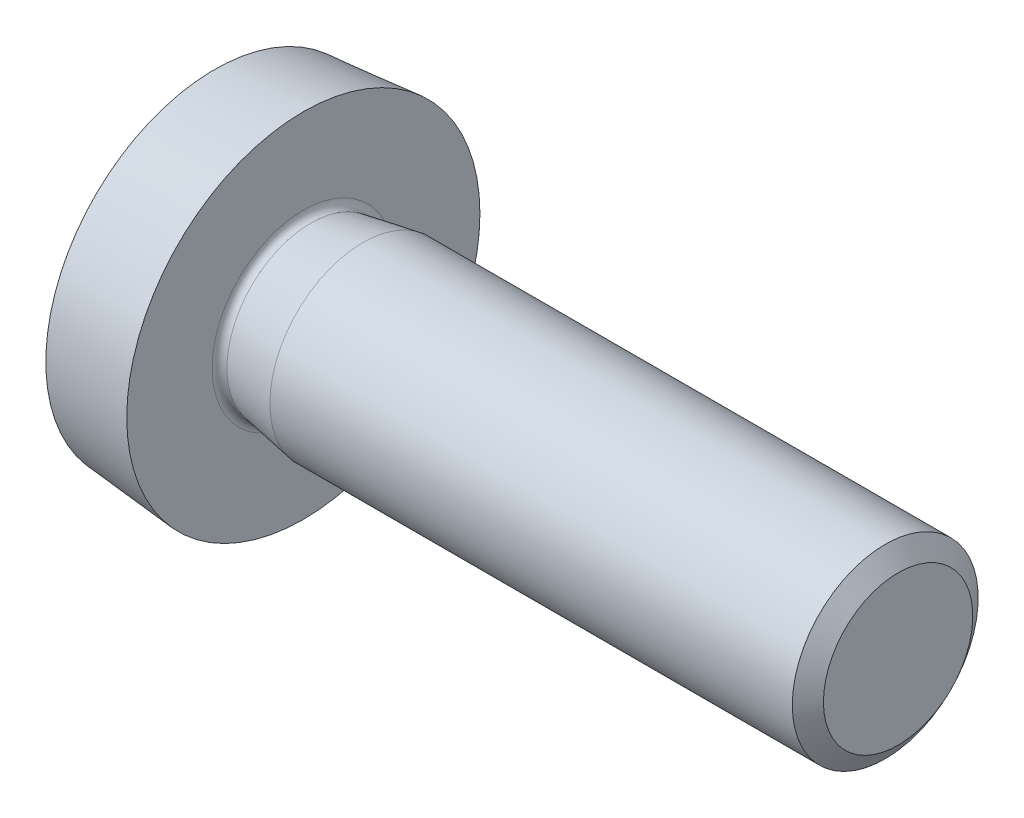
ISO-10303-21;
HEADER;
FILE_DESCRIPTION(('STEP AP214'),'2;1');
FILE_NAME('part.step','',(''),(''),'','','');
FILE_SCHEMA(('AUTOMOTIVE_DESIGN { 1 0 10303 214 1 1 1 1 }'));
ENDSEC;
DATA;
#1=APPLICATION_CONTEXT('core data for automotive mechanical design processes');
#2=APPLICATION_PROTOCOL_DEFINITION('international standard','automotive_design',2000,#1);
#3=PRODUCT_CONTEXT('',#1,'mechanical');
#4=PRODUCT('Part','Part','',(#3));
#5=PRODUCT_RELATED_PRODUCT_CATEGORY('part','',(#4));
#6=PRODUCT_DEFINITION_FORMATION('','',#4);
#7=PRODUCT_DEFINITION_CONTEXT('part definition',#1,'design');
#8=PRODUCT_DEFINITION('design','',#6,#7);
#9=PRODUCT_DEFINITION_SHAPE('','',#8);
#10=(LENGTH_UNIT() NAMED_UNIT(*) SI_UNIT(.MILLI.,.METRE.));
#11=(NAMED_UNIT(*) PLANE_ANGLE_UNIT() SI_UNIT($,.RADIAN.));
#12=(NAMED_UNIT(*) SI_UNIT($,.STERADIAN.) SOLID_ANGLE_UNIT());
#13=UNCERTAINTY_MEASURE_WITH_UNIT(LENGTH_MEASURE(1.E-05),#10,'distance_accuracy_value','');
#14=(GEOMETRIC_REPRESENTATION_CONTEXT(3) GLOBAL_UNCERTAINTY_ASSIGNED_CONTEXT((#13)) GLOBAL_UNIT_ASSIGNED_CONTEXT((#10,
#11,#12)) REPRESENTATION_CONTEXT('',''));
#15=CARTESIAN_POINT('',(0.,0.,0.));
#16=DIRECTION('',(0.,0.,1.));
#17=DIRECTION('',(1.,0.,0.));
#18=AXIS2_PLACEMENT_3D('',#15,#16,#17);
#19=CARTESIAN_POINT('',(-1.9,0.6125,2.45));
#20=DIRECTION('',(0.795355953719722,0.,0.606142645655782));
#21=DIRECTION('',(0.606142645655782,0.,-0.795355953719722));
#22=AXIS2_PLACEMENT_3D('',#19,#20,#21);
#23=PLANE('',#22);
#24=DIRECTION('',(0.,-1.,0.));
#25=VECTOR('',#24,1.);
#26=CARTESIAN_POINT('',(-1.9,0.6125,2.45));
#27=LINE('',#26,#25);
#28=CARTESIAN_POINT('',(-1.9,-0.6125,2.45));
#29=VERTEX_POINT('',#28);
#30=CARTESIAN_POINT('',(-1.9,0.6125,2.45));
#31=VERTEX_POINT('',#30);
#32=EDGE_CURVE('E139',#29,#31,#27,.F.);
#33=ORIENTED_EDGE('',*,*,#32,.T.);
#34=DIRECTION('',(0.606142645655782,0.,-0.795355953719722));
#35=VECTOR('',#34,1.);
#36=CARTESIAN_POINT('',(-1.9,0.6125,2.45));
#37=LINE('',#36,#35);
#38=CARTESIAN_POINT('',(-0.499636922080562,0.6125,0.6125));
#39=VERTEX_POINT('',#38);
#40=EDGE_CURVE('E141',#31,#39,#37,.T.);
#41=ORIENTED_EDGE('',*,*,#40,.T.);
#42=DIRECTION('',(0.,1.,0.));
#43=VECTOR('',#42,1.);
#44=CARTESIAN_POINT('',(-0.499636922080562,0.6125,0.6125));
#45=LINE('',#44,#43);
#46=CARTESIAN_POINT('',(-0.499636922080562,-0.6125,0.6125));
#47=VERTEX_POINT('',#46);
#48=EDGE_CURVE('E107',#47,#39,#45,.T.);
#49=ORIENTED_EDGE('',*,*,#48,.F.);
#50=DIRECTION('',(0.606142645655782,0.,-0.795355953719722));
#51=VECTOR('',#50,1.);
#52=CARTESIAN_POINT('',(-1.9,-0.6125,2.45));
#53=LINE('',#52,#51);
#54=EDGE_CURVE('E144',#29,#47,#53,.T.);
#55=ORIENTED_EDGE('',*,*,#54,.F.);
#56=EDGE_LOOP('',(#33,#41,#49,#55));
#57=FACE_BOUND('',#56,.T.);
#58=ADVANCED_FACE('F17',(#57),#23,.F.);
#59=CARTESIAN_POINT('',(-1.9,-2.45,0.6125));
#60=DIRECTION('',(0.792405815693061,-0.609994281330419,0.));
#61=DIRECTION('',(0.609994281330419,0.792405815693061,0.));
#62=AXIS2_PLACEMENT_3D('',#59,#60,#61);
#63=PLANE('',#62);
#64=DIRECTION('',(0.,0.,-1.));
#65=VECTOR('',#64,1.);
#66=CARTESIAN_POINT('',(-1.9,-2.45,0.6125));
#67=LINE('',#66,#65);
#68=CARTESIAN_POINT('',(-1.9,-2.45,-0.6125));
#69=VERTEX_POINT('',#68);
#70=CARTESIAN_POINT('',(-1.9,-2.45,0.6125));
#71=VERTEX_POINT('',#70);
#72=EDGE_CURVE('E130',#69,#71,#67,.F.);
#73=ORIENTED_EDGE('',*,*,#72,.T.);
#74=DIRECTION('',(0.609994281330419,0.792405815693061,0.));
#75=VECTOR('',#74,1.);
#76=CARTESIAN_POINT('',(-1.9,-2.45,0.6125));
#77=LINE('',#76,#75);
#78=CARTESIAN_POINT('',(-0.485491840485416,-0.6125,0.6125));
#79=VERTEX_POINT('',#78);
#80=EDGE_CURVE('E220',#71,#79,#77,.T.);
#81=ORIENTED_EDGE('',*,*,#80,.T.);
#82=DIRECTION('',(0.,0.,-1.));
#83=VECTOR('',#82,1.);
#84=CARTESIAN_POINT('',(-0.485491840485416,-0.6125,0.6125));
#85=LINE('',#84,#83);
#86=CARTESIAN_POINT('',(-0.485491840485416,-0.6125,-0.6125));
#87=VERTEX_POINT('',#86);
#88=EDGE_CURVE('E200',#79,#87,#85,.T.);
#89=ORIENTED_EDGE('',*,*,#88,.T.);
#90=DIRECTION('',(0.609994281330419,0.792405815693061,0.));
#91=VECTOR('',#90,1.);
#92=CARTESIAN_POINT('',(-1.9,-2.45,-0.6125));
#93=LINE('',#92,#91);
#94=EDGE_CURVE('E205',#69,#87,#93,.T.);
#95=ORIENTED_EDGE('',*,*,#94,.F.);
#96=EDGE_LOOP('',(#73,#81,#89,#95));
#97=FACE_BOUND('',#96,.T.);
#98=ADVANCED_FACE('F522',(#97),#63,.F.);
#99=CARTESIAN_POINT('',(-0.485491840485416,-0.6125,0.6125));
#100=DIRECTION('',(1.,0.,0.));
#101=DIRECTION('',(0.,0.,-1.));
#102=AXIS2_PLACEMENT_3D('',#99,#100,#101);
#103=PLANE('',#102);
#104=ORIENTED_EDGE('',*,*,#88,.F.);
#105=DIRECTION('',(0.,1.,0.));
#106=VECTOR('',#105,1.);
#107=CARTESIAN_POINT('',(-0.485491840485416,0.,0.6125));
#108=LINE('',#107,#106);
#109=CARTESIAN_POINT('',(-0.485491840485416,0.6125,0.6125));
#110=VERTEX_POINT('',#109);
#111=EDGE_CURVE('E222',#79,#110,#108,.T.);
#112=ORIENTED_EDGE('',*,*,#111,.T.);
#113=DIRECTION('',(0.,0.,1.));
#114=VECTOR('',#113,1.);
#115=CARTESIAN_POINT('',(-0.485491840485416,0.6125,0.6125));
#116=LINE('',#115,#114);
#117=CARTESIAN_POINT('',(-0.485491840485416,0.6125,-0.6125));
#118=VERTEX_POINT('',#117);
#119=EDGE_CURVE('E179',#110,#118,#116,.F.);
#120=ORIENTED_EDGE('',*,*,#119,.T.);
#121=DIRECTION('',(0.,1.,0.));
#122=VECTOR('',#121,1.);
#123=CARTESIAN_POINT('',(-0.485491840485416,0.,-0.6125));
#124=LINE('',#123,#122);
#125=EDGE_CURVE('E196',#87,#118,#124,.T.);
#126=ORIENTED_EDGE('',*,*,#125,.F.);
#127=EDGE_LOOP('',(#104,#112,#120,#126));
#128=FACE_BOUND('',#127,.T.);
#129=ADVANCED_FACE('F516',(#128),#103,.F.);
#130=CARTESIAN_POINT('',(-0.485491840485416,0.6125,0.6125));
#131=DIRECTION('',(0.792405815693061,0.609994281330419,0.));
#132=DIRECTION('',(-0.609994281330419,0.792405815693061,0.));
#133=AXIS2_PLACEMENT_3D('',#130,#131,#132);
#134=PLANE('',#133);
#135=ORIENTED_EDGE('',*,*,#119,.F.);
#136=DIRECTION('',(-0.609994281330419,0.792405815693061,0.));
#137=VECTOR('',#136,1.);
#138=CARTESIAN_POINT('',(-0.485491840485416,0.6125,0.6125));
#139=LINE('',#138,#137);
#140=CARTESIAN_POINT('',(-1.9,2.45,0.6125));
#141=VERTEX_POINT('',#140);
#142=EDGE_CURVE('E116',#110,#141,#139,.T.);
#143=ORIENTED_EDGE('',*,*,#142,.T.);
#144=DIRECTION('',(0.,0.,1.));
#145=VECTOR('',#144,1.);
#146=CARTESIAN_POINT('',(-1.9,2.45,0.6125));
#147=LINE('',#146,#145);
#148=CARTESIAN_POINT('',(-1.9,2.45,-0.6125));
#149=VERTEX_POINT('',#148);
#150=EDGE_CURVE('E155',#141,#149,#147,.F.);
#151=ORIENTED_EDGE('',*,*,#150,.T.);
#152=DIRECTION('',(-0.609994281330419,0.792405815693061,0.));
#153=VECTOR('',#152,1.);
#154=CARTESIAN_POINT('',(-0.485491840485416,0.6125,-0.6125));
#155=LINE('',#154,#153);
#156=EDGE_CURVE('E192',#118,#149,#155,.T.);
#157=ORIENTED_EDGE('',*,*,#156,.F.);
#158=EDGE_LOOP('',(#135,#143,#151,#157));
#159=FACE_BOUND('',#158,.T.);
#160=ADVANCED_FACE('F510',(#159),#134,.F.);
#161=CARTESIAN_POINT('',(-0.499636922080562,0.6125,-0.6125));
#162=DIRECTION('',(0.795355953719722,0.,-0.606142645655782));
#163=DIRECTION('',(-0.606142645655782,0.,-0.795355953719722));
#164=AXIS2_PLACEMENT_3D('',#161,#162,#163);
#165=PLANE('',#164);
#166=DIRECTION('',(0.,1.,0.));
#167=VECTOR('',#166,1.);
#168=CARTESIAN_POINT('',(-0.499636922080562,0.,-0.6125));
#169=LINE('',#168,#167);
#170=CARTESIAN_POINT('',(-0.499636922080562,0.6125,-0.6125));
#171=VERTEX_POINT('',#170);
#172=CARTESIAN_POINT('',(-0.499636922080562,-0.6125,-0.6125));
#173=VERTEX_POINT('',#172);
#174=EDGE_CURVE('E182',#171,#173,#169,.F.);
#175=ORIENTED_EDGE('',*,*,#174,.F.);
#176=DIRECTION('',(-0.606142645655782,0.,-0.795355953719722));
#177=VECTOR('',#176,1.);
#178=CARTESIAN_POINT('',(-0.499636922080562,0.6125,-0.6125));
#179=LINE('',#178,#177);
#180=CARTESIAN_POINT('',(-1.9,0.6125,-2.45));
#181=VERTEX_POINT('',#180);
#182=EDGE_CURVE('E122',#171,#181,#179,.T.);
#183=ORIENTED_EDGE('',*,*,#182,.T.);
#184=DIRECTION('',(0.,1.,0.));
#185=VECTOR('',#184,1.);
#186=CARTESIAN_POINT('',(-1.9,0.6125,-2.45));
#187=LINE('',#186,#185);
#188=CARTESIAN_POINT('',(-1.9,-0.6125,-2.45));
#189=VERTEX_POINT('',#188);
#190=EDGE_CURVE('E82',#189,#181,#187,.T.);
#191=ORIENTED_EDGE('',*,*,#190,.F.);
#192=DIRECTION('',(-0.606142645655782,0.,-0.795355953719722));
#193=VECTOR('',#192,1.);
#194=CARTESIAN_POINT('',(-0.499636922080562,-0.6125,-0.6125));
#195=LINE('',#194,#193);
#196=EDGE_CURVE('E169',#173,#189,#195,.T.);
#197=ORIENTED_EDGE('',*,*,#196,.F.);
#198=EDGE_LOOP('',(#175,#183,#191,#197));
#199=FACE_BOUND('',#198,.T.);
#200=ADVANCED_FACE('F363',(#199),#165,.F.);
#201=CARTESIAN_POINT('',(0.,0.6125,0.));
#202=DIRECTION('',(0.,1.,0.));
#203=DIRECTION('',(0.,0.,1.));
#204=AXIS2_PLACEMENT_3D('',#201,#202,#203);
#205=PLANE('',#204);
#206=CARTESIAN_POINT('',(-3.39093826545836,0.612500000000001,-2.45));
#207=CARTESIAN_POINT('',(-3.4150350682797,0.6125,-2.3753410340813));
#208=CARTESIAN_POINT('',(-3.43802974777272,0.6125,-2.30032638397733));
#209=CARTESIAN_POINT('',(-3.48173974576602,0.6125,-2.14984638952965));
#210=CARTESIAN_POINT('',(-3.50246080809341,0.6125,-2.07438271356626));
#211=CARTESIAN_POINT('',(-3.5416395200035,0.6125,-1.92300894506625));
#212=CARTESIAN_POINT('',(-3.5601010114455,0.6125,-1.84709984686944));
#213=CARTESIAN_POINT('',(-3.59477124835233,0.6125,-1.69483803882555));
#214=CARTESIAN_POINT('',(-3.61098192969067,0.6125,-1.61848576977449));
#215=CARTESIAN_POINT('',(-3.64115542565906,0.6125,-1.46533835122616));
#216=CARTESIAN_POINT('',(-3.65511824028911,0.6125,-1.3885432017289));
#217=CARTESIAN_POINT('',(-3.68079512766119,0.6125,-1.23450950096556));
#218=CARTESIAN_POINT('',(-3.69250724200366,0.6125,-1.15727062323585));
#219=CARTESIAN_POINT('',(-3.71367574227189,0.6125,-1.00234843678981));
#220=CARTESIAN_POINT('',(-3.72312819628502,0.6125,-0.924664590804863));
#221=CARTESIAN_POINT('',(-3.73976502793172,0.6125,-0.768850571903129));
#222=CARTESIAN_POINT('',(-3.74694345815036,0.6125,-0.690719763928277));
#223=CARTESIAN_POINT('',(-3.7529672135625,0.612500000000001,-0.612500000000003));
#224=B_SPLINE_CURVE_WITH_KNOTS('',3,(#206,#207,#208,#209,#210,#211,#212,#213,#214,#215,#216,
#217,#218,#219,#220,#221,#222,#223),.UNSPECIFIED.,.F.,.F.,(4,2,2,2,2,2,2,2,4),(0.,
0.235345507909741,0.470082066558827,0.704413797768522,0.938542720015785,1.17267164226305,
1.40700337347274,1.64173993212183,1.87708544003157),.UNSPECIFIED.);
#225=CARTESIAN_POINT('',(-3.39093826545836,0.612500000000001,-2.45));
#226=VERTEX_POINT('',#225);
#227=CARTESIAN_POINT('',(-3.7529672135625,0.6125,-0.6125));
#228=VERTEX_POINT('',#227);
#229=EDGE_CURVE('E73',#226,#228,#224,.T.);
#230=ORIENTED_EDGE('',*,*,#229,.F.);
#231=DIRECTION('',(-1.,0.,0.));
#232=VECTOR('',#231,1.);
#233=CARTESIAN_POINT('',(-1.9,0.6125,-2.45));
#234=LINE('',#233,#232);
#235=EDGE_CURVE('E171',#226,#181,#234,.F.);
#236=ORIENTED_EDGE('',*,*,#235,.T.);
#237=ORIENTED_EDGE('',*,*,#182,.F.);
#238=DIRECTION('',(1.,0.,0.));
#239=VECTOR('',#238,1.);
#240=CARTESIAN_POINT('',(0.,0.6125,-0.6125));
#241=LINE('',#240,#239);
#242=EDGE_CURVE('E186',#228,#171,#241,.T.);
#243=ORIENTED_EDGE('',*,*,#242,.F.);
#244=EDGE_LOOP('',(#230,#236,#237,#243));
#245=FACE_BOUND('',#244,.T.);
#246=ADVANCED_FACE('F357',(#245),#205,.F.);
#247=CARTESIAN_POINT('',(-1.9,2.45,0.6125));
#248=DIRECTION('',(0.,1.,0.));
#249=DIRECTION('',(0.,0.,1.));
#250=AXIS2_PLACEMENT_3D('',#247,#248,#249);
#251=PLANE('',#250);
#252=DIRECTION('',(1.,0.,0.));
#253=VECTOR('',#252,1.);
#254=CARTESIAN_POINT('',(0.,2.45,-0.6125));
#255=LINE('',#254,#253);
#256=CARTESIAN_POINT('',(-3.39093826545836,2.45,-0.6125));
#257=VERTEX_POINT('',#256);
#258=EDGE_CURVE('E195',#149,#257,#255,.F.);
#259=ORIENTED_EDGE('',*,*,#258,.F.);
#260=ORIENTED_EDGE('',*,*,#150,.F.);
#261=DIRECTION('',(1.,0.,0.));
#262=VECTOR('',#261,1.);
#263=CARTESIAN_POINT('',(0.,2.45,0.6125));
#264=LINE('',#263,#262);
#265=CARTESIAN_POINT('',(-3.39093826545836,2.45,0.6125));
#266=VERTEX_POINT('',#265);
#267=EDGE_CURVE('E231',#141,#266,#264,.F.);
#268=ORIENTED_EDGE('',*,*,#267,.T.);
#269=CARTESIAN_POINT('',(-3.39093826545836,2.45,-0.6125));
#270=CARTESIAN_POINT('',(-3.40738540252226,2.45,-0.408333333333334));
#271=CARTESIAN_POINT('',(-3.41560897105421,2.45,-0.204166666666667));
#272=CARTESIAN_POINT('',(-3.41560897105421,2.45,0.204166666666666));
#273=CARTESIAN_POINT('',(-3.40738540252226,2.45,0.408333333333332));
#274=CARTESIAN_POINT('',(-3.39093826545836,2.45,0.612499999999999));
#275=B_SPLINE_CURVE_WITH_KNOTS('',3,(#269,#270,#271,#272,#273,#274),.UNSPECIFIED.,.F.,.F.,(4,2,
4),(0.,0.612996650655284,1.22599330131057),.UNSPECIFIED.);
#276=EDGE_CURVE('E327',#257,#266,#275,.T.);
#277=ORIENTED_EDGE('',*,*,#276,.F.);
#278=EDGE_LOOP('',(#259,#260,#268,#277));
#279=FACE_BOUND('',#278,.T.);
#280=ADVANCED_FACE('F325',(#279),#251,.F.);
#281=CARTESIAN_POINT('',(0.,0.6125,0.));
#282=DIRECTION('',(0.,1.,0.));
#283=DIRECTION('',(0.,0.,1.));
#284=AXIS2_PLACEMENT_3D('',#281,#282,#283);
#285=PLANE('',#284);
#286=ORIENTED_EDGE('',*,*,#40,.F.);
#287=DIRECTION('',(1.,0.,0.));
#288=VECTOR('',#287,1.);
#289=CARTESIAN_POINT('',(-3.99,0.6125,2.45));
#290=LINE('',#289,#288);
#291=CARTESIAN_POINT('',(-3.39093826545836,0.6125,2.45));
#292=VERTEX_POINT('',#291);
#293=EDGE_CURVE('E148',#31,#292,#290,.F.);
#294=ORIENTED_EDGE('',*,*,#293,.T.);
#295=CARTESIAN_POINT('',(-3.7529672135625,0.612500000000003,0.6125));
#296=CARTESIAN_POINT('',(-3.74694345815036,0.612500000000001,0.690719763928274));
#297=CARTESIAN_POINT('',(-3.73976502793172,0.6125,0.768850571903127));
#298=CARTESIAN_POINT('',(-3.72312819628502,0.6125,0.924664590804861));
#299=CARTESIAN_POINT('',(-3.71367574227189,0.6125,1.00234843678981));
#300=CARTESIAN_POINT('',(-3.69250724200366,0.6125,1.15727062323585));
#301=CARTESIAN_POINT('',(-3.68079512766119,0.6125,1.23450950096556));
#302=CARTESIAN_POINT('',(-3.65511824028911,0.6125,1.3885432017289));
#303=CARTESIAN_POINT('',(-3.64115542565906,0.6125,1.46533835122616));
#304=CARTESIAN_POINT('',(-3.61098192969067,0.6125,1.61848576977448));
#305=CARTESIAN_POINT('',(-3.59477124835233,0.6125,1.69483803882555));
#306=CARTESIAN_POINT('',(-3.5601010114455,0.6125,1.84709984686944));
#307=CARTESIAN_POINT('',(-3.54163952000351,0.6125,1.92300894506625));
#308=CARTESIAN_POINT('',(-3.50246080809341,0.6125,2.07438271356626));
#309=CARTESIAN_POINT('',(-3.48173974576602,0.6125,2.14984638952965));
#310=CARTESIAN_POINT('',(-3.43802974777272,0.6125,2.30032638397733));
#311=CARTESIAN_POINT('',(-3.4150350682797,0.612499999999999,2.3753410340813));
#312=CARTESIAN_POINT('',(-3.39093826545836,0.612499999999998,2.45));
#313=B_SPLINE_CURVE_WITH_KNOTS('',3,(#295,#296,#297,#298,#299,#300,#301,#302,#303,#304,#305,
#306,#307,#308,#309,#310,#311,#312),.UNSPECIFIED.,.F.,.F.,(4,2,2,2,2,2,2,2,4),(0.,
0.235345507909741,0.470082066558829,0.704413797768523,0.938542720015787,1.17267164226305,
1.40700337347275,1.64173993212183,1.87708544003157),.UNSPECIFIED.);
#314=CARTESIAN_POINT('',(-3.7529672135625,0.612500000000001,0.6125));
#315=VERTEX_POINT('',#314);
#316=EDGE_CURVE('E333',#315,#292,#313,.T.);
#317=ORIENTED_EDGE('',*,*,#316,.F.);
#318=DIRECTION('',(1.,0.,0.));
#319=VECTOR('',#318,1.);
#320=CARTESIAN_POINT('',(0.,0.6125,0.6125));
#321=LINE('',#320,#319);
#322=EDGE_CURVE('E154',#315,#39,#321,.T.);
#323=ORIENTED_EDGE('',*,*,#322,.T.);
#324=EDGE_LOOP('',(#286,#294,#317,#323));
#325=FACE_BOUND('',#324,.T.);
#326=ADVANCED_FACE('F151',(#325),#285,.F.);
#327=CARTESIAN_POINT('',(-3.99,0.6125,2.45));
#328=DIRECTION('',(0.,0.,1.));
#329=DIRECTION('',(0.,-1.,0.));
#330=AXIS2_PLACEMENT_3D('',#327,#328,#329);
#331=PLANE('',#330);
#332=ORIENTED_EDGE('',*,*,#293,.F.);
#333=ORIENTED_EDGE('',*,*,#32,.F.);
#334=DIRECTION('',(1.,0.,0.));
#335=VECTOR('',#334,1.);
#336=CARTESIAN_POINT('',(0.,-0.6125,2.45));
#337=LINE('',#336,#335);
#338=CARTESIAN_POINT('',(-3.39093826545836,-0.6125,2.45));
#339=VERTEX_POINT('',#338);
#340=EDGE_CURVE('E161',#339,#29,#337,.T.);
#341=ORIENTED_EDGE('',*,*,#340,.F.);
#342=CARTESIAN_POINT('',(-3.39093826545836,0.612499999999999,2.45));
#343=CARTESIAN_POINT('',(-3.40738540252226,0.408333333333332,2.45));
#344=CARTESIAN_POINT('',(-3.41560897105421,0.204166666666666,2.45));
#345=CARTESIAN_POINT('',(-3.41560897105421,-0.204166666666667,2.45));
#346=CARTESIAN_POINT('',(-3.40738540252226,-0.408333333333334,2.45));
#347=CARTESIAN_POINT('',(-3.39093826545836,-0.6125,2.45));
#348=B_SPLINE_CURVE_WITH_KNOTS('',3,(#342,#343,#344,#345,#346,#347),.UNSPECIFIED.,.F.,.F.,(4,2,
4),(0.,0.612996650655284,1.22599330131057),.UNSPECIFIED.);
#349=EDGE_CURVE('E159',#292,#339,#348,.T.);
#350=ORIENTED_EDGE('',*,*,#349,.F.);
#351=EDGE_LOOP('',(#332,#333,#341,#350));
#352=FACE_BOUND('',#351,.T.);
#353=ADVANCED_FACE('F157',(#352),#331,.F.);
#354=CARTESIAN_POINT('',(0.,-0.6125,0.));
#355=DIRECTION('',(0.,1.,0.));
#356=DIRECTION('',(0.,0.,1.));
#357=AXIS2_PLACEMENT_3D('',#354,#355,#356);
#358=PLANE('',#357);
#359=ORIENTED_EDGE('',*,*,#340,.T.);
#360=ORIENTED_EDGE('',*,*,#54,.T.);
#361=DIRECTION('',(1.,0.,0.));
#362=VECTOR('',#361,1.);
#363=CARTESIAN_POINT('',(0.,-0.6125,0.6125));
#364=LINE('',#363,#362);
#365=CARTESIAN_POINT('',(-3.7529672135625,-0.612500000000001,0.6125));
#366=VERTEX_POINT('',#365);
#367=EDGE_CURVE('E217',#47,#366,#364,.F.);
#368=ORIENTED_EDGE('',*,*,#367,.T.);
#369=CARTESIAN_POINT('',(-3.39093826545836,-0.612499999999999,2.45));
#370=CARTESIAN_POINT('',(-3.4150350682797,-0.6125,2.3753410340813));
#371=CARTESIAN_POINT('',(-3.43802974777273,-0.6125,2.30032638397734));
#372=CARTESIAN_POINT('',(-3.48173974576602,-0.6125,2.14984638952965));
#373=CARTESIAN_POINT('',(-3.50246080809341,-0.6125,2.07438271356626));
#374=CARTESIAN_POINT('',(-3.54163952000351,-0.6125,1.92300894506625));
#375=CARTESIAN_POINT('',(-3.5601010114455,-0.6125,1.84709984686944));
#376=CARTESIAN_POINT('',(-3.59477124835233,-0.6125,1.69483803882555));
#377=CARTESIAN_POINT('',(-3.61098192969068,-0.6125,1.61848576977449));
#378=CARTESIAN_POINT('',(-3.64115542565906,-0.6125,1.46533835122616));
#379=CARTESIAN_POINT('',(-3.65511824028911,-0.6125,1.3885432017289));
#380=CARTESIAN_POINT('',(-3.68079512766119,-0.6125,1.23450950096556));
#381=CARTESIAN_POINT('',(-3.69250724200366,-0.6125,1.15727062323585));
#382=CARTESIAN_POINT('',(-3.71367574227189,-0.6125,1.00234843678981));
#383=CARTESIAN_POINT('',(-3.72312819628502,-0.6125,0.924664590804861));
#384=CARTESIAN_POINT('',(-3.73976502793172,-0.6125,0.768850571903128));
#385=CARTESIAN_POINT('',(-3.74694345815036,-0.6125,0.690719763928275));
#386=CARTESIAN_POINT('',(-3.7529672135625,-0.6125,0.612500000000001));
#387=B_SPLINE_CURVE_WITH_KNOTS('',3,(#369,#370,#371,#372,#373,#374,#375,#376,#377,#378,#379,
#380,#381,#382,#383,#384,#385,#386),.UNSPECIFIED.,.F.,.F.,(4,2,2,2,2,2,2,2,4),(0.,
0.235345507909741,0.470082066558829,0.704413797768523,0.938542720015787,1.17267164226305,
1.40700337347275,1.64173993212183,1.87708544003157),.UNSPECIFIED.);
#388=EDGE_CURVE('E641',#339,#366,#387,.T.);
#389=ORIENTED_EDGE('',*,*,#388,.F.);
#390=EDGE_LOOP('',(#359,#360,#368,#389));
#391=FACE_BOUND('',#390,.T.);
#392=ADVANCED_FACE('F479',(#391),#358,.T.);
#393=CARTESIAN_POINT('',(0.,0.,0.6125));
#394=DIRECTION('',(0.,0.,1.));
#395=DIRECTION('',(1.,0.,0.));
#396=AXIS2_PLACEMENT_3D('',#393,#394,#395);
#397=PLANE('',#396);
#398=ORIENTED_EDGE('',*,*,#48,.T.);
#399=ORIENTED_EDGE('',*,*,#322,.F.);
#400=CARTESIAN_POINT('',(-3.39093826545836,2.45,0.6125));
#401=CARTESIAN_POINT('',(-3.4150350682797,2.3753410340813,0.6125));
#402=CARTESIAN_POINT('',(-3.43802974777272,2.30032638397733,0.6125));
#403=CARTESIAN_POINT('',(-3.48173974576602,2.14984638952964,0.6125));
#404=CARTESIAN_POINT('',(-3.50246080809341,2.07438271356626,0.6125));
#405=CARTESIAN_POINT('',(-3.5416395200035,1.92300894506624,0.6125));
#406=CARTESIAN_POINT('',(-3.5601010114455,1.84709984686943,0.6125));
#407=CARTESIAN_POINT('',(-3.59477124835233,1.69483803882555,0.6125));
#408=CARTESIAN_POINT('',(-3.61098192969068,1.61848576977448,0.6125));
#409=CARTESIAN_POINT('',(-3.64115542565906,1.46533835122616,0.6125));
#410=CARTESIAN_POINT('',(-3.65511824028911,1.3885432017289,0.6125));
#411=CARTESIAN_POINT('',(-3.68079512766119,1.23450950096556,0.6125));
#412=CARTESIAN_POINT('',(-3.69250724200366,1.15727062323585,0.6125));
#413=CARTESIAN_POINT('',(-3.71367574227189,1.0023484367898,0.6125));
#414=CARTESIAN_POINT('',(-3.72312819628502,0.924664590804858,0.6125));
#415=CARTESIAN_POINT('',(-3.73976502793172,0.768850571903124,0.6125));
#416=CARTESIAN_POINT('',(-3.74694345815036,0.690719763928271,0.612500000000001));
#417=CARTESIAN_POINT('',(-3.7529672135625,0.612499999999997,0.612500000000002));
#418=B_SPLINE_CURVE_WITH_KNOTS('',3,(#400,#401,#402,#403,#404,#405,#406,#407,#408,#409,#410,
#411,#412,#413,#414,#415,#416,#417),.UNSPECIFIED.,.F.,.F.,(4,2,2,2,2,2,2,2,4),(0.,
0.235345507909741,0.470082066558829,0.704413797768525,0.938542720015788,1.17267164226305,
1.40700337347275,1.64173993212184,1.87708544003158),.UNSPECIFIED.);
#419=EDGE_CURVE('E330',#266,#315,#418,.T.);
#420=ORIENTED_EDGE('',*,*,#419,.F.);
#421=ORIENTED_EDGE('',*,*,#267,.F.);
#422=ORIENTED_EDGE('',*,*,#142,.F.);
#423=ORIENTED_EDGE('',*,*,#111,.F.);
#424=ORIENTED_EDGE('',*,*,#80,.F.);
#425=DIRECTION('',(1.,0.,0.));
#426=VECTOR('',#425,1.);
#427=CARTESIAN_POINT('',(-4.18,-2.45,0.6125));
#428=LINE('',#427,#426);
#429=CARTESIAN_POINT('',(-3.39093826545836,-2.45,0.612499999999999));
#430=VERTEX_POINT('',#429);
#431=EDGE_CURVE('E216',#71,#430,#428,.F.);
#432=ORIENTED_EDGE('',*,*,#431,.T.);
#433=CARTESIAN_POINT('',(-3.7529672135625,-0.612500000000003,0.612499999999999));
#434=CARTESIAN_POINT('',(-3.74694345815036,-0.690719763928277,0.6125));
#435=CARTESIAN_POINT('',(-3.73976502793172,-0.768850571903129,0.6125));
#436=CARTESIAN_POINT('',(-3.72312819628502,-0.924664590804863,0.6125));
#437=CARTESIAN_POINT('',(-3.71367574227189,-1.00234843678981,0.6125));
#438=CARTESIAN_POINT('',(-3.69250724200366,-1.15727062323585,0.6125));
#439=CARTESIAN_POINT('',(-3.68079512766119,-1.23450950096556,0.6125));
#440=CARTESIAN_POINT('',(-3.65511824028911,-1.3885432017289,0.6125));
#441=CARTESIAN_POINT('',(-3.64115542565906,-1.46533835122616,0.6125));
#442=CARTESIAN_POINT('',(-3.61098192969067,-1.61848576977449,0.6125));
#443=CARTESIAN_POINT('',(-3.59477124835233,-1.69483803882555,0.6125));
#444=CARTESIAN_POINT('',(-3.5601010114455,-1.84709984686944,0.6125));
#445=CARTESIAN_POINT('',(-3.54163952000351,-1.92300894506625,0.6125));
#446=CARTESIAN_POINT('',(-3.50246080809341,-2.07438271356626,0.6125));
#447=CARTESIAN_POINT('',(-3.48173974576602,-2.14984638952965,0.6125));
#448=CARTESIAN_POINT('',(-3.43802974777272,-2.30032638397734,0.6125));
#449=CARTESIAN_POINT('',(-3.4150350682797,-2.3753410340813,0.612499999999999));
#450=CARTESIAN_POINT('',(-3.39093826545836,-2.45,0.612499999999997));
#451=B_SPLINE_CURVE_WITH_KNOTS('',3,(#433,#434,#435,#436,#437,#438,#439,#440,#441,#442,#443,
#444,#445,#446,#447,#448,#449,#450),.UNSPECIFIED.,.F.,.F.,(4,2,2,2,2,2,2,2,4),(0.,
0.235345507909741,0.470082066558828,0.704413797768523,0.938542720015786,1.17267164226305,
1.40700337347274,1.64173993212183,1.87708544003157),.UNSPECIFIED.);
#452=EDGE_CURVE('E637',#366,#430,#451,.T.);
#453=ORIENTED_EDGE('',*,*,#452,.F.);
#454=ORIENTED_EDGE('',*,*,#367,.F.);
#455=EDGE_LOOP('',(#398,#399,#420,#421,#422,#423,#424,#432,#453,#454));
#456=FACE_BOUND('',#455,.T.);
#457=ADVANCED_FACE('F331',(#456),#397,.F.);
#458=CARTESIAN_POINT('',(-4.18,-2.45,0.6125));
#459=DIRECTION('',(0.,-1.,0.));
#460=DIRECTION('',(0.,0.,-1.));
#461=AXIS2_PLACEMENT_3D('',#458,#459,#460);
#462=PLANE('',#461);
#463=ORIENTED_EDGE('',*,*,#431,.F.);
#464=ORIENTED_EDGE('',*,*,#72,.F.);
#465=DIRECTION('',(1.,0.,0.));
#466=VECTOR('',#465,1.);
#467=CARTESIAN_POINT('',(0.,-2.45,-0.6125));
#468=LINE('',#467,#466);
#469=CARTESIAN_POINT('',(-3.39093826545836,-2.45,-0.6125));
#470=VERTEX_POINT('',#469);
#471=EDGE_CURVE('E185',#470,#69,#468,.T.);
#472=ORIENTED_EDGE('',*,*,#471,.F.);
#473=CARTESIAN_POINT('',(-3.39093826545836,-2.45,0.612499999999998));
#474=CARTESIAN_POINT('',(-3.40738540252226,-2.45,0.408333333333332));
#475=CARTESIAN_POINT('',(-3.41560897105421,-2.45,0.204166666666666));
#476=CARTESIAN_POINT('',(-3.41560897105421,-2.45,-0.204166666666667));
#477=CARTESIAN_POINT('',(-3.40738540252226,-2.45,-0.408333333333334));
#478=CARTESIAN_POINT('',(-3.39093826545836,-2.45,-0.6125));
#479=B_SPLINE_CURVE_WITH_KNOTS('',3,(#473,#474,#475,#476,#477,#478),.UNSPECIFIED.,.F.,.F.,(4,2,
4),(0.,0.612996650655284,1.22599330131057),.UNSPECIFIED.);
#480=EDGE_CURVE('E632',#430,#470,#479,.T.);
#481=ORIENTED_EDGE('',*,*,#480,.F.);
#482=EDGE_LOOP('',(#463,#464,#472,#481));
#483=FACE_BOUND('',#482,.T.);
#484=ADVANCED_FACE('F465',(#483),#462,.F.);
#485=CARTESIAN_POINT('',(0.,0.,-0.6125));
#486=DIRECTION('',(0.,0.,1.));
#487=DIRECTION('',(1.,0.,0.));
#488=AXIS2_PLACEMENT_3D('',#485,#486,#487);
#489=PLANE('',#488);
#490=ORIENTED_EDGE('',*,*,#258,.T.);
#491=CARTESIAN_POINT('',(-3.7529672135625,0.6125,-0.612500000000001));
#492=CARTESIAN_POINT('',(-3.74694345815036,0.690719763928274,-0.6125));
#493=CARTESIAN_POINT('',(-3.73976502793172,0.768850571903126,-0.6125));
#494=CARTESIAN_POINT('',(-3.72312819628502,0.92466459080486,-0.6125));
#495=CARTESIAN_POINT('',(-3.71367574227189,1.00234843678981,-0.6125));
#496=CARTESIAN_POINT('',(-3.69250724200366,1.15727062323585,-0.6125));
#497=CARTESIAN_POINT('',(-3.68079512766119,1.23450950096556,-0.6125));
#498=CARTESIAN_POINT('',(-3.65511824028911,1.3885432017289,-0.6125));
#499=CARTESIAN_POINT('',(-3.64115542565906,1.46533835122616,-0.6125));
#500=CARTESIAN_POINT('',(-3.61098192969067,1.61848576977449,-0.6125));
#501=CARTESIAN_POINT('',(-3.59477124835233,1.69483803882555,-0.6125));
#502=CARTESIAN_POINT('',(-3.5601010114455,1.84709984686944,-0.6125));
#503=CARTESIAN_POINT('',(-3.5416395200035,1.92300894506625,-0.6125));
#504=CARTESIAN_POINT('',(-3.50246080809341,2.07438271356626,-0.6125));
#505=CARTESIAN_POINT('',(-3.48173974576602,2.14984638952965,-0.6125));
#506=CARTESIAN_POINT('',(-3.43802974777272,2.30032638397734,-0.6125));
#507=CARTESIAN_POINT('',(-3.4150350682797,2.3753410340813,-0.6125));
#508=CARTESIAN_POINT('',(-3.39093826545836,2.45,-0.612500000000001));
#509=B_SPLINE_CURVE_WITH_KNOTS('',3,(#491,#492,#493,#494,#495,#496,#497,#498,#499,#500,#501,
#502,#503,#504,#505,#506,#507,#508),.UNSPECIFIED.,.F.,.F.,(4,2,2,2,2,2,2,2,4),(0.,
0.235345507909741,0.470082066558829,0.704413797768524,0.938542720015788,1.17267164226305,
1.40700337347275,1.64173993212184,1.87708544003158),.UNSPECIFIED.);
#510=EDGE_CURVE('E337',#228,#257,#509,.T.);
#511=ORIENTED_EDGE('',*,*,#510,.F.);
#512=ORIENTED_EDGE('',*,*,#242,.T.);
#513=ORIENTED_EDGE('',*,*,#174,.T.);
#514=DIRECTION('',(1.,0.,0.));
#515=VECTOR('',#514,1.);
#516=CARTESIAN_POINT('',(0.,-0.6125,-0.6125));
#517=LINE('',#516,#515);
#518=CARTESIAN_POINT('',(-3.7529672135625,-0.612500000000001,-0.6125));
#519=VERTEX_POINT('',#518);
#520=EDGE_CURVE('E172',#519,#173,#517,.T.);
#521=ORIENTED_EDGE('',*,*,#520,.F.);
#522=CARTESIAN_POINT('',(-3.39093826545836,-2.45,-0.6125));
#523=CARTESIAN_POINT('',(-3.4150350682797,-2.3753410340813,-0.6125));
#524=CARTESIAN_POINT('',(-3.43802974777272,-2.30032638397734,-0.6125));
#525=CARTESIAN_POINT('',(-3.48173974576602,-2.14984638952965,-0.6125));
#526=CARTESIAN_POINT('',(-3.50246080809341,-2.07438271356626,-0.6125));
#527=CARTESIAN_POINT('',(-3.5416395200035,-1.92300894506626,-0.6125));
#528=CARTESIAN_POINT('',(-3.5601010114455,-1.84709984686945,-0.6125));
#529=CARTESIAN_POINT('',(-3.59477124835233,-1.69483803882557,-0.6125));
#530=CARTESIAN_POINT('',(-3.61098192969067,-1.6184857697745,-0.6125));
#531=CARTESIAN_POINT('',(-3.64115542565906,-1.46533835122618,-0.6125));
#532=CARTESIAN_POINT('',(-3.65511824028911,-1.38854320172892,-0.6125));
#533=CARTESIAN_POINT('',(-3.68079512766118,-1.23450950096558,-0.6125));
#534=CARTESIAN_POINT('',(-3.69250724200365,-1.15727062323588,-0.6125));
#535=CARTESIAN_POINT('',(-3.71367574227189,-1.00234843678983,-0.6125));
#536=CARTESIAN_POINT('',(-3.72312819628502,-0.92466459080489,-0.612500000000001));
#537=CARTESIAN_POINT('',(-3.73976502793171,-0.76885057190316,-0.612499999999999));
#538=CARTESIAN_POINT('',(-3.74694345815036,-0.690719763928309,-0.612499999999995));
#539=CARTESIAN_POINT('',(-3.75296721356249,-0.612500000000036,-0.612499999999986));
#540=B_SPLINE_CURVE_WITH_KNOTS('',3,(#522,#523,#524,#525,#526,#527,#528,#529,#530,#531,#532,
#533,#534,#535,#536,#537,#538,#539),.UNSPECIFIED.,.F.,.F.,(4,2,2,2,2,2,2,2,4),(0.,
0.235345507909736,0.470082066558819,0.70441379776851,0.938542720015768,1.17267164226303,
1.40700337347272,1.6417399321218,1.87708544003154),.UNSPECIFIED.);
#541=EDGE_CURVE('E636',#470,#519,#540,.T.);
#542=ORIENTED_EDGE('',*,*,#541,.F.);
#543=ORIENTED_EDGE('',*,*,#471,.T.);
#544=ORIENTED_EDGE('',*,*,#94,.T.);
#545=ORIENTED_EDGE('',*,*,#125,.T.);
#546=ORIENTED_EDGE('',*,*,#156,.T.);
#547=EDGE_LOOP('',(#490,#511,#512,#513,#521,#542,#543,#544,#545,#546));
#548=FACE_BOUND('',#547,.T.);
#549=ADVANCED_FACE('F459',(#548),#489,.T.);
#550=CARTESIAN_POINT('',(0.,-0.6125,0.));
#551=DIRECTION('',(0.,1.,0.));
#552=DIRECTION('',(0.,0.,1.));
#553=AXIS2_PLACEMENT_3D('',#550,#551,#552);
#554=PLANE('',#553);
#555=DIRECTION('',(-1.,0.,0.));
#556=VECTOR('',#555,1.);
#557=CARTESIAN_POINT('',(-1.9,-0.6125,-2.45));
#558=LINE('',#557,#556);
#559=CARTESIAN_POINT('',(-3.39093826545836,-0.6125,-2.45));
#560=VERTEX_POINT('',#559);
#561=EDGE_CURVE('E35',#189,#560,#558,.T.);
#562=ORIENTED_EDGE('',*,*,#561,.T.);
#563=CARTESIAN_POINT('',(-3.7529672135625,-0.612500000000002,-0.6125));
#564=CARTESIAN_POINT('',(-3.74694345815036,-0.612500000000001,-0.690719763928275));
#565=CARTESIAN_POINT('',(-3.73976502793172,-0.6125,-0.768850571903127));
#566=CARTESIAN_POINT('',(-3.72312819628502,-0.6125,-0.924664590804862));
#567=CARTESIAN_POINT('',(-3.71367574227189,-0.6125,-1.00234843678981));
#568=CARTESIAN_POINT('',(-3.69250724200366,-0.6125,-1.15727062323585));
#569=CARTESIAN_POINT('',(-3.68079512766119,-0.6125,-1.23450950096556));
#570=CARTESIAN_POINT('',(-3.65511824028911,-0.6125,-1.3885432017289));
#571=CARTESIAN_POINT('',(-3.64115542565906,-0.6125,-1.46533835122616));
#572=CARTESIAN_POINT('',(-3.61098192969067,-0.6125,-1.61848576977449));
#573=CARTESIAN_POINT('',(-3.59477124835233,-0.6125,-1.69483803882555));
#574=CARTESIAN_POINT('',(-3.5601010114455,-0.6125,-1.84709984686944));
#575=CARTESIAN_POINT('',(-3.5416395200035,-0.6125,-1.92300894506625));
#576=CARTESIAN_POINT('',(-3.50246080809341,-0.6125,-2.07438271356626));
#577=CARTESIAN_POINT('',(-3.48173974576602,-0.6125,-2.14984638952965));
#578=CARTESIAN_POINT('',(-3.43802974777272,-0.6125,-2.30032638397734));
#579=CARTESIAN_POINT('',(-3.41503506827969,-0.6125,-2.3753410340813));
#580=CARTESIAN_POINT('',(-3.39093826545836,-0.612500000000001,-2.45000000000001));
#581=B_SPLINE_CURVE_WITH_KNOTS('',3,(#563,#564,#565,#566,#567,#568,#569,#570,#571,#572,#573,
#574,#575,#576,#577,#578,#579,#580),.UNSPECIFIED.,.F.,.F.,(4,2,2,2,2,2,2,2,4),(0.,
0.235345507909742,0.47008206655883,0.704413797768525,0.938542720015789,1.17267164226305,
1.40700337347275,1.64173993212184,1.87708544003158),.UNSPECIFIED.);
#582=EDGE_CURVE('E262',#519,#560,#581,.T.);
#583=ORIENTED_EDGE('',*,*,#582,.F.);
#584=ORIENTED_EDGE('',*,*,#520,.T.);
#585=ORIENTED_EDGE('',*,*,#196,.T.);
#586=EDGE_LOOP('',(#562,#583,#584,#585));
#587=FACE_BOUND('',#586,.T.);
#588=ADVANCED_FACE('F452',(#587),#554,.T.);
#589=CARTESIAN_POINT('',(-1.9,0.6125,-2.45));
#590=DIRECTION('',(0.,0.,-1.));
#591=DIRECTION('',(-1.,0.,0.));
#592=AXIS2_PLACEMENT_3D('',#589,#590,#591);
#593=PLANE('',#592);
#594=ORIENTED_EDGE('',*,*,#561,.F.);
#595=ORIENTED_EDGE('',*,*,#190,.T.);
#596=ORIENTED_EDGE('',*,*,#235,.F.);
#597=CARTESIAN_POINT('',(-3.39093826545836,-0.6125,-2.45));
#598=CARTESIAN_POINT('',(-3.40738540252226,-0.408333333333333,-2.45));
#599=CARTESIAN_POINT('',(-3.41560897105421,-0.204166666666666,-2.45));
#600=CARTESIAN_POINT('',(-3.41560897105421,0.204166666666667,-2.45));
#601=CARTESIAN_POINT('',(-3.40738540252226,0.408333333333334,-2.45));
#602=CARTESIAN_POINT('',(-3.39093826545836,0.612500000000001,-2.45));
#603=B_SPLINE_CURVE_WITH_KNOTS('',3,(#597,#598,#599,#600,#601,#602),.UNSPECIFIED.,.F.,.F.,(4,2,
4),(0.,0.612996650655285,1.22599330131057),.UNSPECIFIED.);
#604=EDGE_CURVE('E254',#560,#226,#603,.T.);
#605=ORIENTED_EDGE('',*,*,#604,.F.);
#606=EDGE_LOOP('',(#594,#595,#596,#605));
#607=FACE_BOUND('',#606,.T.);
#608=ADVANCED_FACE('F268',(#607),#593,.F.);
#609=CARTESIAN_POINT('',(4.2,0.,0.));
#610=DIRECTION('',(0.520480024067807,0.66987814494269,0.529493923925965));
#611=DIRECTION('',(-0.585177856226655,0.731421861444596,-0.350127030066088));
#612=AXIS2_PLACEMENT_3D('',#609,#610,#611);
#613=SPHERICAL_SURFACE('',#612,8.);
#614=CARTESIAN_POINT('',(-2.38613199974225,0.,0.));
#615=DIRECTION('',(1.,0.,0.));
#616=DIRECTION('',(0.,0.,-1.));
#617=AXIS2_PLACEMENT_3D('',#614,#615,#616);
#618=CIRCLE('',#617,4.54124050034963);
#619=CARTESIAN_POINT('',(-2.38613199974225,0.,-4.54124050034963));
#620=VERTEX_POINT('',#619);
#621=EDGE_CURVE('E251',#620,#620,#618,.T.);
#622=ORIENTED_EDGE('',*,*,#621,.F.);
#623=EDGE_LOOP('',(#622));
#624=FACE_BOUND('',#623,.T.);
#625=ORIENTED_EDGE('',*,*,#582,.T.);
#626=ORIENTED_EDGE('',*,*,#604,.T.);
#627=ORIENTED_EDGE('',*,*,#229,.T.);
#628=ORIENTED_EDGE('',*,*,#510,.T.);
#629=ORIENTED_EDGE('',*,*,#276,.T.);
#630=ORIENTED_EDGE('',*,*,#419,.T.);
#631=ORIENTED_EDGE('',*,*,#316,.T.);
#632=ORIENTED_EDGE('',*,*,#349,.T.);
#633=ORIENTED_EDGE('',*,*,#388,.T.);
#634=ORIENTED_EDGE('',*,*,#452,.T.);
#635=ORIENTED_EDGE('',*,*,#480,.T.);
#636=ORIENTED_EDGE('',*,*,#541,.T.);
#637=EDGE_LOOP('',(#625,#626,#627,#628,#629,#630,#631,#632,#633,#634,#635,#636));
#638=FACE_BOUND('',#637,.T.);
#639=ADVANCED_FACE('F270',(#624,#638),#613,.T.);
#640=CARTESIAN_POINT('',(-5.6843709704817E-11,0.,0.));
#641=DIRECTION('',(1.,0.,0.));
#642=DIRECTION('',(0.,0.,-1.));
#643=AXIS2_PLACEMENT_3D('',#640,#641,#642);
#644=CONICAL_SURFACE('',#643,4.75000000000136,0.0872664626008885);
#645=ORIENTED_EDGE('',*,*,#621,.T.);
#646=EDGE_LOOP('',(#645));
#647=FACE_BOUND('',#646,.T.);
#648=CARTESIAN_POINT('',(0.,0.,0.));
#649=DIRECTION('',(1.,0.,0.));
#650=DIRECTION('',(0.,0.,-1.));
#651=AXIS2_PLACEMENT_3D('',#648,#649,#650);
#652=CIRCLE('',#651,4.75000000000634);
#653=CARTESIAN_POINT('',(0.,0.,-4.75000000000634));
#654=VERTEX_POINT('',#653);
#655=EDGE_CURVE('E248',#654,#654,#652,.T.);
#656=ORIENTED_EDGE('',*,*,#655,.F.);
#657=EDGE_LOOP('',(#656));
#658=FACE_BOUND('',#657,.T.);
#659=ADVANCED_FACE('F275',(#647,#658),#644,.T.);
#660=CARTESIAN_POINT('',(0.,0.,-3.602375));
#661=DIRECTION('',(1.,0.,0.));
#662=DIRECTION('',(0.,1.,0.));
#663=AXIS2_PLACEMENT_3D('',#660,#661,#662);
#664=PLANE('',#663);
#665=CARTESIAN_POINT('',(0.,0.,0.));
#666=DIRECTION('',(1.,0.,0.));
#667=DIRECTION('',(0.,0.,-1.));
#668=AXIS2_PLACEMENT_3D('',#665,#666,#667);
#669=CIRCLE('',#668,2.45475);
#670=CARTESIAN_POINT('',(0.,0.,-2.45475));
#671=VERTEX_POINT('',#670);
#672=EDGE_CURVE('E247',#671,#671,#669,.T.);
#673=ORIENTED_EDGE('',*,*,#672,.F.);
#674=EDGE_LOOP('',(#673));
#675=FACE_BOUND('',#674,.T.);
#676=ORIENTED_EDGE('',*,*,#655,.T.);
#677=EDGE_LOOP('',(#676));
#678=FACE_BOUND('',#677,.T.);
#679=ADVANCED_FACE('F420',(#675,#678),#664,.T.);
#680=CARTESIAN_POINT('',(16.,0.,-1.00475));
#681=DIRECTION('',(1.,0.,0.));
#682=DIRECTION('',(0.,1.,0.));
#683=AXIS2_PLACEMENT_3D('',#680,#681,#682);
#684=PLANE('',#683);
#685=CARTESIAN_POINT('',(15.999999999996,0.,0.));
#686=DIRECTION('',(-1.,0.,0.));
#687=DIRECTION('',(0.,0.,1.));
#688=AXIS2_PLACEMENT_3D('',#685,#686,#687);
#689=CIRCLE('',#688,2.00949999992872);
#690=CARTESIAN_POINT('',(15.999999999996,0.,2.00949999992872));
#691=VERTEX_POINT('',#690);
#692=EDGE_CURVE('E243',#691,#691,#689,.T.);
#693=ORIENTED_EDGE('',*,*,#692,.F.);
#694=EDGE_LOOP('',(#693));
#695=FACE_BOUND('',#694,.T.);
#696=ADVANCED_FACE('F407',(#695),#684,.T.);
#697=CARTESIAN_POINT('',(0.2,0.,0.));
#698=DIRECTION('',(-1.,0.,0.));
#699=DIRECTION('',(0.,0.,1.));
#700=AXIS2_PLACEMENT_3D('',#697,#698,#699);
#701=TOROIDAL_SURFACE('',#700,2.45475,0.2);
#702=CARTESIAN_POINT('',(0.200000000006639,0.,0.));
#703=DIRECTION('',(1.,0.,0.));
#704=DIRECTION('',(0.,0.,-1.));
#705=AXIS2_PLACEMENT_3D('',#702,#703,#704);
#706=CIRCLE('',#705,2.25474999999165);
#707=CARTESIAN_POINT('',(0.200000000006639,0.,-2.25474999999165));
#708=VERTEX_POINT('',#707);
#709=EDGE_CURVE('E246',#708,#708,#706,.T.);
#710=ORIENTED_EDGE('',*,*,#709,.F.);
#711=EDGE_LOOP('',(#710));
#712=FACE_BOUND('',#711,.T.);
#713=ORIENTED_EDGE('',*,*,#672,.T.);
#714=EDGE_LOOP('',(#713));
#715=FACE_BOUND('',#714,.T.);
#716=ADVANCED_FACE('F401',(#712,#715),#701,.F.);
#717=CARTESIAN_POINT('',(15.6531641237052,0.,0.));
#718=DIRECTION('',(-1.,0.,0.));
#719=DIRECTION('',(0.,0.,1.));
#720=AXIS2_PLACEMENT_3D('',#717,#718,#719);
#721=CONICAL_SURFACE('',#720,2.50000000005457,0.955316618083994);
#722=ORIENTED_EDGE('',*,*,#692,.T.);
#723=EDGE_LOOP('',(#722));
#724=FACE_BOUND('',#723,.T.);
#725=CARTESIAN_POINT('',(15.653164123828,0.,0.));
#726=DIRECTION('',(-1.,0.,0.));
#727=DIRECTION('',(0.,0.,1.));
#728=AXIS2_PLACEMENT_3D('',#725,#726,#727);
#729=CIRCLE('',#728,2.5);
#730=CARTESIAN_POINT('',(15.653164123828,0.,2.5));
#731=VERTEX_POINT('',#730);
#732=EDGE_CURVE('E26',#731,#731,#729,.T.);
#733=ORIENTED_EDGE('',*,*,#732,.F.);
#734=EDGE_LOOP('',(#733));
#735=FACE_BOUND('',#734,.T.);
#736=ADVANCED_FACE('F398',(#724,#735),#721,.T.);
#737=CARTESIAN_POINT('',(1.59999999993943,0.,0.));
#738=DIRECTION('',(1.,0.,0.));
#739=DIRECTION('',(0.,1.,0.));
#740=AXIS2_PLACEMENT_3D('',#737,#738,#739);
#741=CONICAL_SURFACE('',#740,2.49999999998352,0.173418926375133);
#742=ORIENTED_EDGE('',*,*,#709,.T.);
#743=EDGE_LOOP('',(#742));
#744=FACE_BOUND('',#743,.T.);
#745=CARTESIAN_POINT('',(1.6,0.,0.));
#746=DIRECTION('',(-1.,0.,0.));
#747=DIRECTION('',(0.,0.,1.));
#748=AXIS2_PLACEMENT_3D('',#745,#746,#747);
#749=CIRCLE('',#748,2.5);
#750=CARTESIAN_POINT('',(1.6,0.,2.5));
#751=VERTEX_POINT('',#750);
#752=EDGE_CURVE('E11',#751,#751,#749,.F.);
#753=ORIENTED_EDGE('',*,*,#752,.F.);
#754=EDGE_LOOP('',(#753));
#755=FACE_BOUND('',#754,.T.);
#756=ADVANCED_FACE('F394',(#744,#755),#741,.T.);
#757=CARTESIAN_POINT('',(8.626582061914,0.,0.));
#758=DIRECTION('',(-1.,0.,0.));
#759=DIRECTION('',(0.,0.,1.));
#760=AXIS2_PLACEMENT_3D('',#757,#758,#759);
#761=CYLINDRICAL_SURFACE('',#760,2.5);
#762=ORIENTED_EDGE('',*,*,#732,.T.);
#763=EDGE_LOOP('',(#762));
#764=FACE_BOUND('',#763,.T.);
#765=ORIENTED_EDGE('',*,*,#752,.T.);
#766=EDGE_LOOP('',(#765));
#767=FACE_BOUND('',#766,.T.);
#768=ADVANCED_FACE('F391',(#764,#767),#761,.T.);
#769=CLOSED_SHELL('',(#58,#98,#129,#160,#200,#246,#280,#326,#353,#392,#457,#484,#549,#588,#608,
#639,#659,#679,#696,#716,#736,#756,#768));
#770=CARTESIAN_POINT('',(0.,0.,0.));
#771=DIRECTION('',(1.,0.,0.));
#772=DIRECTION('',(0.,0.,-1.));
#773=AXIS2_PLACEMENT_3D('',#770,#771,#772);
#774=PLANE('',#773);
#775=CARTESIAN_POINT('',(0.,0.,0.));
#776=DIRECTION('',(1.,0.,0.));
#777=DIRECTION('',(0.,0.,-1.));
#778=AXIS2_PLACEMENT_3D('',#775,#776,#777);
#779=CIRCLE('',#778,0.5);
#780=CARTESIAN_POINT('',(0.,0.,-0.5));
#781=VERTEX_POINT('',#780);
#782=EDGE_CURVE('E20',#781,#781,#779,.T.);
#783=ORIENTED_EDGE('',*,*,#782,.T.);
#784=EDGE_LOOP('',(#783));
#785=FACE_BOUND('',#784,.T.);
#786=ADVANCED_FACE('F374',(#785),#774,.T.);
#787=CARTESIAN_POINT('',(0.,0.,0.));
#788=DIRECTION('',(1.,0.,0.));
#789=DIRECTION('',(0.,0.,-1.));
#790=AXIS2_PLACEMENT_3D('',#787,#788,#789);
#791=CYLINDRICAL_SURFACE('',#790,0.5);
#792=ORIENTED_EDGE('',*,*,#782,.F.);
#793=EDGE_LOOP('',(#792));
#794=FACE_BOUND('',#793,.T.);
#795=CARTESIAN_POINT('',(0.4019,0.,0.));
#796=DIRECTION('',(1.,0.,0.));
#797=DIRECTION('',(0.,0.,-1.));
#798=AXIS2_PLACEMENT_3D('',#795,#796,#797);
#799=CIRCLE('',#798,0.5);
#800=CARTESIAN_POINT('',(0.4019,0.,-0.5));
#801=VERTEX_POINT('',#800);
#802=EDGE_CURVE('E238',#801,#801,#799,.T.);
#803=ORIENTED_EDGE('',*,*,#802,.T.);
#804=EDGE_LOOP('',(#803));
#805=FACE_BOUND('',#804,.T.);
#806=ADVANCED_FACE('F376',(#794,#805),#791,.F.);
#807=CARTESIAN_POINT('',(0.4019,0.,0.));
#808=DIRECTION('',(1.,0.,0.));
#809=DIRECTION('',(0.,0.,-1.));
#810=AXIS2_PLACEMENT_3D('',#807,#808,#809);
#811=PLANE('',#810);
#812=ORIENTED_EDGE('',*,*,#802,.F.);
#813=EDGE_LOOP('',(#812));
#814=FACE_BOUND('',#813,.T.);
#815=ADVANCED_FACE('F378',(#814),#811,.F.);
#816=CLOSED_SHELL('',(#786,#806,#815));
#817=ORIENTED_CLOSED_SHELL('',*,#816,.T.);
#818=BREP_WITH_VOIDS('B1',#769,(#817));
#819=ADVANCED_BREP_SHAPE_REPRESENTATION('',(#18,#818),#14);
#820=SHAPE_DEFINITION_REPRESENTATION(#9,#819);
ENDSEC;
END-ISO-10303-21;
